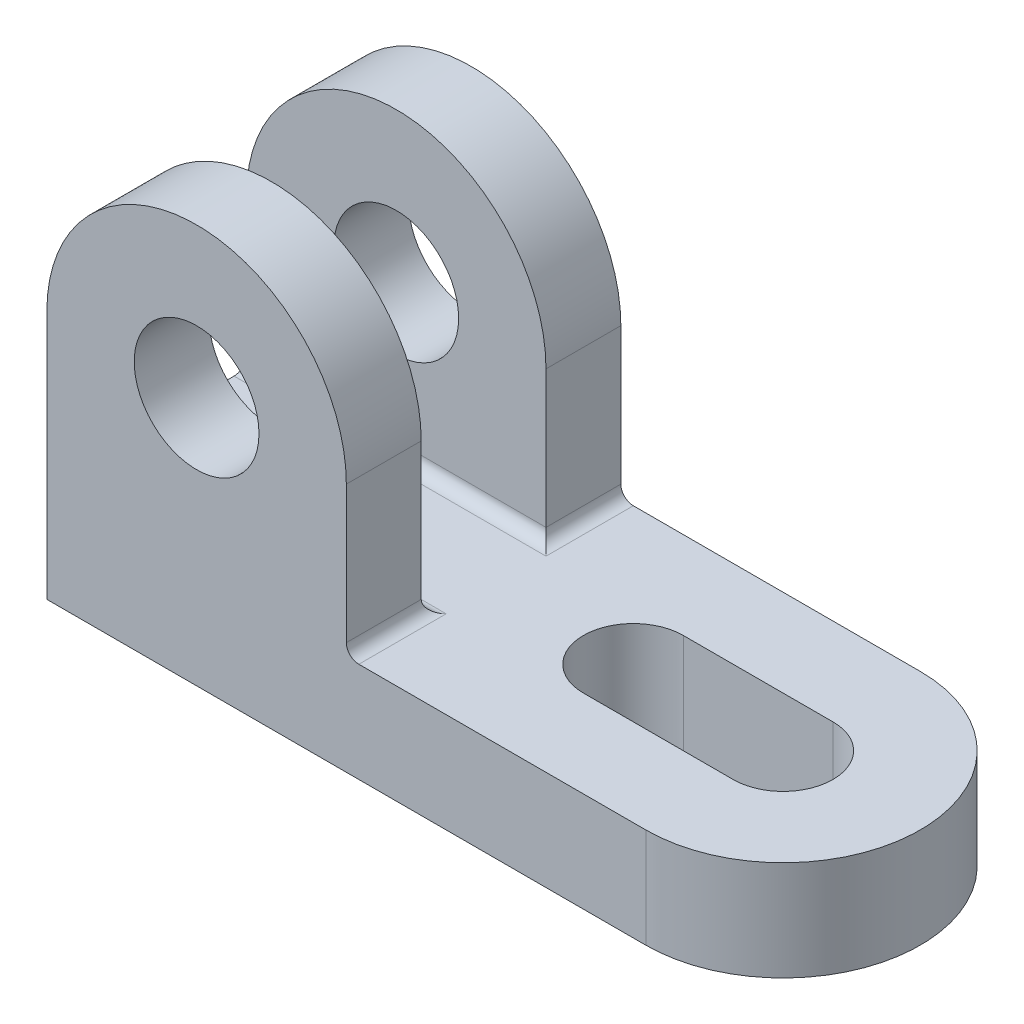
ISO-10303-21;
HEADER;
FILE_DESCRIPTION(('STEP AP214'),'2;1');
FILE_NAME('part.step','',(''),(''),'','','');
FILE_SCHEMA(('AUTOMOTIVE_DESIGN { 1 0 10303 214 1 1 1 1 }'));
ENDSEC;
DATA;
#1=APPLICATION_CONTEXT('core data for automotive mechanical design processes');
#2=APPLICATION_PROTOCOL_DEFINITION('international standard','automotive_design',2000,#1);
#3=PRODUCT_CONTEXT('',#1,'mechanical');
#4=PRODUCT('Part','Part','',(#3));
#5=PRODUCT_RELATED_PRODUCT_CATEGORY('part','',(#4));
#6=PRODUCT_DEFINITION_FORMATION('','',#4);
#7=PRODUCT_DEFINITION_CONTEXT('part definition',#1,'design');
#8=PRODUCT_DEFINITION('design','',#6,#7);
#9=PRODUCT_DEFINITION_SHAPE('','',#8);
#10=(LENGTH_UNIT() NAMED_UNIT(*) SI_UNIT(.MILLI.,.METRE.));
#11=(NAMED_UNIT(*) PLANE_ANGLE_UNIT() SI_UNIT($,.RADIAN.));
#12=(NAMED_UNIT(*) SI_UNIT($,.STERADIAN.) SOLID_ANGLE_UNIT());
#13=UNCERTAINTY_MEASURE_WITH_UNIT(LENGTH_MEASURE(1.E-05),#10,'distance_accuracy_value','');
#14=(GEOMETRIC_REPRESENTATION_CONTEXT(3) GLOBAL_UNCERTAINTY_ASSIGNED_CONTEXT((#13)) GLOBAL_UNIT_ASSIGNED_CONTEXT((#10,
#11,#12)) REPRESENTATION_CONTEXT('',''));
#15=CARTESIAN_POINT('',(0.,0.,0.));
#16=DIRECTION('',(0.,0.,1.));
#17=DIRECTION('',(1.,0.,0.));
#18=AXIS2_PLACEMENT_3D('',#15,#16,#17);
#19=CARTESIAN_POINT('',(0.,16.,0.));
#20=DIRECTION('',(0.,1.,0.));
#21=DIRECTION('',(0.,0.,1.));
#22=AXIS2_PLACEMENT_3D('',#19,#20,#21);
#23=PLANE('',#22);
#24=CARTESIAN_POINT('',(37.,16.,0.));
#25=DIRECTION('',(0.,1.,0.));
#26=DIRECTION('',(0.,0.,1.));
#27=AXIS2_PLACEMENT_3D('',#24,#25,#26);
#28=CIRCLE('',#27,8.);
#29=CARTESIAN_POINT('',(37.,16.,8.));
#30=VERTEX_POINT('',#29);
#31=CARTESIAN_POINT('',(37.,16.,-8.));
#32=VERTEX_POINT('',#31);
#33=EDGE_CURVE('E229',#30,#32,#28,.T.);
#34=ORIENTED_EDGE('',*,*,#33,.F.);
#35=DIRECTION('',(1.,0.,0.));
#36=VECTOR('',#35,1.);
#37=CARTESIAN_POINT('',(37.,16.,8.));
#38=LINE('',#37,#36);
#39=CARTESIAN_POINT('',(13.,16.,8.));
#40=VERTEX_POINT('',#39);
#41=EDGE_CURVE('E238',#40,#30,#38,.T.);
#42=ORIENTED_EDGE('',*,*,#41,.F.);
#43=CARTESIAN_POINT('',(13.,16.,0.));
#44=DIRECTION('',(0.,1.,0.));
#45=DIRECTION('',(0.,0.,1.));
#46=AXIS2_PLACEMENT_3D('',#43,#44,#45);
#47=CIRCLE('',#46,8.);
#48=CARTESIAN_POINT('',(13.,16.,-7.99999999999999));
#49=VERTEX_POINT('',#48);
#50=EDGE_CURVE('E257',#49,#40,#47,.T.);
#51=ORIENTED_EDGE('',*,*,#50,.F.);
#52=DIRECTION('',(-1.,0.,0.));
#53=VECTOR('',#52,1.);
#54=CARTESIAN_POINT('',(37.,16.,-8.));
#55=LINE('',#54,#53);
#56=EDGE_CURVE('E253',#32,#49,#55,.T.);
#57=ORIENTED_EDGE('',*,*,#56,.F.);
#58=EDGE_LOOP('',(#34,#42,#51,#57));
#59=FACE_BOUND('',#58,.T.);
#60=DIRECTION('',(-1.,0.,0.));
#61=VECTOR('',#60,1.);
#62=CARTESIAN_POINT('',(0.,16.,8.));
#63=LINE('',#62,#61);
#64=CARTESIAN_POINT('',(-59.,16.,8.));
#65=VERTEX_POINT('',#64);
#66=CARTESIAN_POINT('',(-9.,16.,8.));
#67=VERTEX_POINT('',#66);
#68=EDGE_CURVE('E324',#65,#67,#63,.F.);
#69=ORIENTED_EDGE('',*,*,#68,.T.);
#70=DIRECTION('',(0.,0.,1.));
#71=VECTOR('',#70,1.);
#72=CARTESIAN_POINT('',(-9.,16.,22.));
#73=LINE('',#72,#71);
#74=CARTESIAN_POINT('',(-9.,16.,22.));
#75=VERTEX_POINT('',#74);
#76=EDGE_CURVE('E327',#67,#75,#73,.T.);
#77=ORIENTED_EDGE('',*,*,#76,.T.);
#78=DIRECTION('',(1.,0.,0.));
#79=VECTOR('',#78,1.);
#80=CARTESIAN_POINT('',(0.,16.,22.));
#81=LINE('',#80,#79);
#82=CARTESIAN_POINT('',(37.,16.,22.));
#83=VERTEX_POINT('',#82);
#84=EDGE_CURVE('E277',#75,#83,#81,.T.);
#85=ORIENTED_EDGE('',*,*,#84,.T.);
#86=CARTESIAN_POINT('',(37.,16.,0.));
#87=DIRECTION('',(0.,1.,0.));
#88=DIRECTION('',(0.,0.,1.));
#89=AXIS2_PLACEMENT_3D('',#86,#87,#88);
#90=CIRCLE('',#89,22.);
#91=CARTESIAN_POINT('',(37.,16.,-22.));
#92=VERTEX_POINT('',#91);
#93=EDGE_CURVE('E280',#83,#92,#90,.T.);
#94=ORIENTED_EDGE('',*,*,#93,.T.);
#95=DIRECTION('',(1.,0.,0.));
#96=VECTOR('',#95,1.);
#97=CARTESIAN_POINT('',(0.,16.,-22.));
#98=LINE('',#97,#96);
#99=CARTESIAN_POINT('',(-9.,16.,-22.));
#100=VERTEX_POINT('',#99);
#101=EDGE_CURVE('E285',#100,#92,#98,.T.);
#102=ORIENTED_EDGE('',*,*,#101,.F.);
#103=DIRECTION('',(0.,0.,-1.));
#104=VECTOR('',#103,1.);
#105=CARTESIAN_POINT('',(-9.,16.,0.));
#106=LINE('',#105,#104);
#107=CARTESIAN_POINT('',(-9.,16.,-8.));
#108=VERTEX_POINT('',#107);
#109=EDGE_CURVE('E321',#100,#108,#106,.F.);
#110=ORIENTED_EDGE('',*,*,#109,.T.);
#111=DIRECTION('',(-1.,0.,0.));
#112=VECTOR('',#111,1.);
#113=CARTESIAN_POINT('',(0.,16.,-8.));
#114=LINE('',#113,#112);
#115=CARTESIAN_POINT('',(-59.,16.,-8.));
#116=VERTEX_POINT('',#115);
#117=EDGE_CURVE('E318',#108,#116,#114,.T.);
#118=ORIENTED_EDGE('',*,*,#117,.T.);
#119=DIRECTION('',(0.,0.,-1.));
#120=VECTOR('',#119,1.);
#121=CARTESIAN_POINT('',(-59.,16.,0.));
#122=LINE('',#121,#120);
#123=EDGE_CURVE('E288',#65,#116,#122,.T.);
#124=ORIENTED_EDGE('',*,*,#123,.F.);
#125=EDGE_LOOP('',(#69,#77,#85,#94,#102,#110,#118,#124));
#126=FACE_BOUND('',#125,.T.);
#127=ADVANCED_FACE('F49',(#59,#126),#23,.T.);
#128=CARTESIAN_POINT('',(0.,16.,22.));
#129=DIRECTION('',(0.,0.,-1.));
#130=DIRECTION('',(-1.,0.,0.));
#131=AXIS2_PLACEMENT_3D('',#128,#129,#130);
#132=PLANE('',#131);
#133=DIRECTION('',(1.,0.,0.));
#134=VECTOR('',#133,1.);
#135=CARTESIAN_POINT('',(0.,0.,22.));
#136=LINE('',#135,#134);
#137=CARTESIAN_POINT('',(-59.,0.,22.));
#138=VERTEX_POINT('',#137);
#139=CARTESIAN_POINT('',(37.,0.,22.));
#140=VERTEX_POINT('',#139);
#141=EDGE_CURVE('E267',#138,#140,#136,.T.);
#142=ORIENTED_EDGE('',*,*,#141,.T.);
#143=DIRECTION('',(0.,-1.,0.));
#144=VECTOR('',#143,1.);
#145=CARTESIAN_POINT('',(37.,16.,22.));
#146=LINE('',#145,#144);
#147=EDGE_CURVE('E314',#83,#140,#146,.T.);
#148=ORIENTED_EDGE('',*,*,#147,.F.);
#149=ORIENTED_EDGE('',*,*,#84,.F.);
#150=CARTESIAN_POINT('',(-9.,18.,22.));
#151=DIRECTION('',(0.,0.,-1.));
#152=DIRECTION('',(-1.,0.,0.));
#153=AXIS2_PLACEMENT_3D('',#150,#151,#152);
#154=CIRCLE('',#153,2.);
#155=CARTESIAN_POINT('',(-11.,18.,22.));
#156=VERTEX_POINT('',#155);
#157=EDGE_CURVE('E343',#75,#156,#154,.T.);
#158=ORIENTED_EDGE('',*,*,#157,.T.);
#159=DIRECTION('',(0.,1.,0.));
#160=VECTOR('',#159,1.);
#161=CARTESIAN_POINT('',(-11.,0.,22.));
#162=LINE('',#161,#160);
#163=CARTESIAN_POINT('',(-11.,40.,22.));
#164=VERTEX_POINT('',#163);
#165=EDGE_CURVE('E219',#156,#164,#162,.T.);
#166=ORIENTED_EDGE('',*,*,#165,.T.);
#167=CARTESIAN_POINT('',(-35.,40.,22.));
#168=DIRECTION('',(0.,0.,1.));
#169=DIRECTION('',(1.,0.,0.));
#170=AXIS2_PLACEMENT_3D('',#167,#168,#169);
#171=CIRCLE('',#170,24.);
#172=CARTESIAN_POINT('',(-59.,40.,22.));
#173=VERTEX_POINT('',#172);
#174=EDGE_CURVE('E205',#164,#173,#171,.T.);
#175=ORIENTED_EDGE('',*,*,#174,.T.);
#176=DIRECTION('',(0.,-1.,0.));
#177=VECTOR('',#176,1.);
#178=CARTESIAN_POINT('',(-59.,16.,22.));
#179=LINE('',#178,#177);
#180=EDGE_CURVE('E291',#173,#138,#179,.T.);
#181=ORIENTED_EDGE('',*,*,#180,.T.);
#182=EDGE_LOOP('',(#142,#148,#149,#158,#166,#175,#181));
#183=FACE_BOUND('',#182,.T.);
#184=CARTESIAN_POINT('',(-35.,40.,22.));
#185=DIRECTION('',(0.,0.,1.));
#186=DIRECTION('',(1.,0.,0.));
#187=AXIS2_PLACEMENT_3D('',#184,#185,#186);
#188=CIRCLE('',#187,10.);
#189=CARTESIAN_POINT('',(-25.,40.,22.));
#190=VERTEX_POINT('',#189);
#191=EDGE_CURVE('E195',#190,#190,#188,.T.);
#192=ORIENTED_EDGE('',*,*,#191,.F.);
#193=EDGE_LOOP('',(#192));
#194=FACE_BOUND('',#193,.T.);
#195=ADVANCED_FACE('F384',(#183,#194),#132,.F.);
#196=CARTESIAN_POINT('',(37.,16.,0.));
#197=DIRECTION('',(0.,-1.,0.));
#198=DIRECTION('',(0.,0.,-1.));
#199=AXIS2_PLACEMENT_3D('',#196,#197,#198);
#200=CYLINDRICAL_SURFACE('',#199,22.);
#201=CARTESIAN_POINT('',(37.,0.,0.));
#202=DIRECTION('',(0.,1.,0.));
#203=DIRECTION('',(0.,0.,1.));
#204=AXIS2_PLACEMENT_3D('',#201,#202,#203);
#205=CIRCLE('',#204,22.);
#206=CARTESIAN_POINT('',(37.,0.,-22.));
#207=VERTEX_POINT('',#206);
#208=EDGE_CURVE('E295',#140,#207,#205,.T.);
#209=ORIENTED_EDGE('',*,*,#208,.T.);
#210=DIRECTION('',(0.,-1.,0.));
#211=VECTOR('',#210,1.);
#212=CARTESIAN_POINT('',(37.,16.,-22.));
#213=LINE('',#212,#211);
#214=EDGE_CURVE('E311',#92,#207,#213,.T.);
#215=ORIENTED_EDGE('',*,*,#214,.F.);
#216=ORIENTED_EDGE('',*,*,#93,.F.);
#217=ORIENTED_EDGE('',*,*,#147,.T.);
#218=EDGE_LOOP('',(#209,#215,#216,#217));
#219=FACE_BOUND('',#218,.T.);
#220=ADVANCED_FACE('F389',(#219),#200,.T.);
#221=CARTESIAN_POINT('',(0.,16.,-22.));
#222=DIRECTION('',(0.,0.,-1.));
#223=DIRECTION('',(-1.,0.,0.));
#224=AXIS2_PLACEMENT_3D('',#221,#222,#223);
#225=PLANE('',#224);
#226=DIRECTION('',(1.,0.,0.));
#227=VECTOR('',#226,1.);
#228=CARTESIAN_POINT('',(0.,0.,-22.));
#229=LINE('',#228,#227);
#230=CARTESIAN_POINT('',(-59.,0.,-22.));
#231=VERTEX_POINT('',#230);
#232=EDGE_CURVE('E299',#231,#207,#229,.T.);
#233=ORIENTED_EDGE('',*,*,#232,.F.);
#234=DIRECTION('',(0.,-1.,0.));
#235=VECTOR('',#234,1.);
#236=CARTESIAN_POINT('',(-59.,16.,-22.));
#237=LINE('',#236,#235);
#238=CARTESIAN_POINT('',(-59.,40.,-22.));
#239=VERTEX_POINT('',#238);
#240=EDGE_CURVE('E308',#239,#231,#237,.T.);
#241=ORIENTED_EDGE('',*,*,#240,.F.);
#242=CARTESIAN_POINT('',(-35.,40.,-22.));
#243=DIRECTION('',(0.,0.,1.));
#244=DIRECTION('',(1.,0.,0.));
#245=AXIS2_PLACEMENT_3D('',#242,#243,#244);
#246=CIRCLE('',#245,24.);
#247=CARTESIAN_POINT('',(-11.,40.,-22.));
#248=VERTEX_POINT('',#247);
#249=EDGE_CURVE('E189',#248,#239,#246,.T.);
#250=ORIENTED_EDGE('',*,*,#249,.F.);
#251=DIRECTION('',(0.,1.,0.));
#252=VECTOR('',#251,1.);
#253=CARTESIAN_POINT('',(-11.,0.,-22.));
#254=LINE('',#253,#252);
#255=CARTESIAN_POINT('',(-11.,18.,-22.));
#256=VERTEX_POINT('',#255);
#257=EDGE_CURVE('E396',#256,#248,#254,.T.);
#258=ORIENTED_EDGE('',*,*,#257,.F.);
#259=CARTESIAN_POINT('',(-9.,18.,-22.));
#260=DIRECTION('',(0.,0.,-1.));
#261=DIRECTION('',(-1.,0.,0.));
#262=AXIS2_PLACEMENT_3D('',#259,#260,#261);
#263=CIRCLE('',#262,2.);
#264=EDGE_CURVE('E59',#256,#100,#263,.F.);
#265=ORIENTED_EDGE('',*,*,#264,.T.);
#266=ORIENTED_EDGE('',*,*,#101,.T.);
#267=ORIENTED_EDGE('',*,*,#214,.T.);
#268=EDGE_LOOP('',(#233,#241,#250,#258,#265,#266,#267));
#269=FACE_BOUND('',#268,.T.);
#270=CARTESIAN_POINT('',(-35.,40.,-22.));
#271=DIRECTION('',(0.,0.,1.));
#272=DIRECTION('',(1.,0.,0.));
#273=AXIS2_PLACEMENT_3D('',#270,#271,#272);
#274=CIRCLE('',#273,10.);
#275=CARTESIAN_POINT('',(-25.,40.,-22.));
#276=VERTEX_POINT('',#275);
#277=EDGE_CURVE('E353',#276,#276,#274,.T.);
#278=ORIENTED_EDGE('',*,*,#277,.T.);
#279=EDGE_LOOP('',(#278));
#280=FACE_BOUND('',#279,.T.);
#281=ADVANCED_FACE('F393',(#269,#280),#225,.T.);
#282=CARTESIAN_POINT('',(-59.,16.,0.));
#283=DIRECTION('',(-1.,0.,0.));
#284=DIRECTION('',(0.,0.,1.));
#285=AXIS2_PLACEMENT_3D('',#282,#283,#284);
#286=PLANE('',#285);
#287=DIRECTION('',(0.,0.,-1.));
#288=VECTOR('',#287,1.);
#289=CARTESIAN_POINT('',(-59.,0.,0.));
#290=LINE('',#289,#288);
#291=EDGE_CURVE('E281',#138,#231,#290,.T.);
#292=ORIENTED_EDGE('',*,*,#291,.F.);
#293=ORIENTED_EDGE('',*,*,#180,.F.);
#294=DIRECTION('',(0.,0.,1.));
#295=VECTOR('',#294,1.);
#296=CARTESIAN_POINT('',(-59.,40.,10.));
#297=LINE('',#296,#295);
#298=CARTESIAN_POINT('',(-59.,40.,10.));
#299=VERTEX_POINT('',#298);
#300=EDGE_CURVE('E225',#299,#173,#297,.T.);
#301=ORIENTED_EDGE('',*,*,#300,.F.);
#302=DIRECTION('',(0.,1.,0.));
#303=VECTOR('',#302,1.);
#304=CARTESIAN_POINT('',(-59.,0.,10.));
#305=LINE('',#304,#303);
#306=CARTESIAN_POINT('',(-59.,18.,10.));
#307=VERTEX_POINT('',#306);
#308=EDGE_CURVE('E212',#307,#299,#305,.T.);
#309=ORIENTED_EDGE('',*,*,#308,.F.);
#310=CARTESIAN_POINT('',(-59.,18.,8.));
#311=DIRECTION('',(-1.,0.,0.));
#312=DIRECTION('',(0.,0.,1.));
#313=AXIS2_PLACEMENT_3D('',#310,#311,#312);
#314=CIRCLE('',#313,2.);
#315=EDGE_CURVE('E346',#307,#65,#314,.F.);
#316=ORIENTED_EDGE('',*,*,#315,.T.);
#317=ORIENTED_EDGE('',*,*,#123,.T.);
#318=CARTESIAN_POINT('',(-59.,18.,-8.));
#319=DIRECTION('',(-1.,0.,0.));
#320=DIRECTION('',(0.,0.,1.));
#321=AXIS2_PLACEMENT_3D('',#318,#319,#320);
#322=CIRCLE('',#321,2.);
#323=CARTESIAN_POINT('',(-59.,18.,-10.));
#324=VERTEX_POINT('',#323);
#325=EDGE_CURVE('E11',#116,#324,#322,.F.);
#326=ORIENTED_EDGE('',*,*,#325,.T.);
#327=DIRECTION('',(0.,1.,0.));
#328=VECTOR('',#327,1.);
#329=CARTESIAN_POINT('',(-59.,0.,-10.));
#330=LINE('',#329,#328);
#331=CARTESIAN_POINT('',(-59.,40.,-10.));
#332=VERTEX_POINT('',#331);
#333=EDGE_CURVE('E168',#324,#332,#330,.T.);
#334=ORIENTED_EDGE('',*,*,#333,.T.);
#335=DIRECTION('',(0.,0.,-1.));
#336=VECTOR('',#335,1.);
#337=CARTESIAN_POINT('',(-59.,40.,-10.));
#338=LINE('',#337,#336);
#339=EDGE_CURVE('E173',#332,#239,#338,.T.);
#340=ORIENTED_EDGE('',*,*,#339,.T.);
#341=ORIENTED_EDGE('',*,*,#240,.T.);
#342=EDGE_LOOP('',(#292,#293,#301,#309,#316,#317,#326,#334,#340,#341));
#343=FACE_BOUND('',#342,.T.);
#344=ADVANCED_FACE('F171',(#343),#286,.T.);
#345=CARTESIAN_POINT('',(0.,0.,0.));
#346=DIRECTION('',(0.,1.,0.));
#347=DIRECTION('',(0.,0.,1.));
#348=AXIS2_PLACEMENT_3D('',#345,#346,#347);
#349=PLANE('',#348);
#350=DIRECTION('',(1.,0.,0.));
#351=VECTOR('',#350,1.);
#352=CARTESIAN_POINT('',(37.,0.,8.));
#353=LINE('',#352,#351);
#354=CARTESIAN_POINT('',(13.,0.,8.));
#355=VERTEX_POINT('',#354);
#356=CARTESIAN_POINT('',(37.,0.,8.));
#357=VERTEX_POINT('',#356);
#358=EDGE_CURVE('E246',#355,#357,#353,.T.);
#359=ORIENTED_EDGE('',*,*,#358,.T.);
#360=CARTESIAN_POINT('',(37.,0.,0.));
#361=DIRECTION('',(0.,1.,0.));
#362=DIRECTION('',(0.,0.,1.));
#363=AXIS2_PLACEMENT_3D('',#360,#361,#362);
#364=CIRCLE('',#363,8.);
#365=CARTESIAN_POINT('',(37.,0.,-8.));
#366=VERTEX_POINT('',#365);
#367=EDGE_CURVE('E233',#357,#366,#364,.T.);
#368=ORIENTED_EDGE('',*,*,#367,.T.);
#369=DIRECTION('',(-1.,0.,0.));
#370=VECTOR('',#369,1.);
#371=CARTESIAN_POINT('',(37.,0.,-8.));
#372=LINE('',#371,#370);
#373=CARTESIAN_POINT('',(13.,0.,-7.99999999999999));
#374=VERTEX_POINT('',#373);
#375=EDGE_CURVE('E237',#366,#374,#372,.T.);
#376=ORIENTED_EDGE('',*,*,#375,.T.);
#377=CARTESIAN_POINT('',(13.,0.,0.));
#378=DIRECTION('',(0.,1.,0.));
#379=DIRECTION('',(0.,0.,1.));
#380=AXIS2_PLACEMENT_3D('',#377,#378,#379);
#381=CIRCLE('',#380,8.);
#382=EDGE_CURVE('E242',#374,#355,#381,.T.);
#383=ORIENTED_EDGE('',*,*,#382,.T.);
#384=EDGE_LOOP('',(#359,#368,#376,#383));
#385=FACE_BOUND('',#384,.T.);
#386=ORIENTED_EDGE('',*,*,#141,.F.);
#387=ORIENTED_EDGE('',*,*,#291,.T.);
#388=ORIENTED_EDGE('',*,*,#232,.T.);
#389=ORIENTED_EDGE('',*,*,#208,.F.);
#390=EDGE_LOOP('',(#386,#387,#388,#389));
#391=FACE_BOUND('',#390,.T.);
#392=ADVANCED_FACE('F434',(#385,#391),#349,.F.);
#393=CARTESIAN_POINT('',(37.,0.,0.));
#394=DIRECTION('',(0.,1.,0.));
#395=DIRECTION('',(0.,0.,1.));
#396=AXIS2_PLACEMENT_3D('',#393,#394,#395);
#397=CYLINDRICAL_SURFACE('',#396,8.);
#398=ORIENTED_EDGE('',*,*,#33,.T.);
#399=DIRECTION('',(0.,1.,0.));
#400=VECTOR('',#399,1.);
#401=CARTESIAN_POINT('',(37.,0.,-8.));
#402=LINE('',#401,#400);
#403=EDGE_CURVE('E250',#366,#32,#402,.T.);
#404=ORIENTED_EDGE('',*,*,#403,.F.);
#405=ORIENTED_EDGE('',*,*,#367,.F.);
#406=DIRECTION('',(0.,1.,0.));
#407=VECTOR('',#406,1.);
#408=CARTESIAN_POINT('',(37.,0.,8.));
#409=LINE('',#408,#407);
#410=EDGE_CURVE('E264',#357,#30,#409,.T.);
#411=ORIENTED_EDGE('',*,*,#410,.T.);
#412=EDGE_LOOP('',(#398,#404,#405,#411));
#413=FACE_BOUND('',#412,.T.);
#414=ADVANCED_FACE('F432',(#413),#397,.F.);
#415=CARTESIAN_POINT('',(37.,0.,8.));
#416=DIRECTION('',(0.,0.,1.));
#417=DIRECTION('',(1.,0.,0.));
#418=AXIS2_PLACEMENT_3D('',#415,#416,#417);
#419=PLANE('',#418);
#420=ORIENTED_EDGE('',*,*,#41,.T.);
#421=ORIENTED_EDGE('',*,*,#410,.F.);
#422=ORIENTED_EDGE('',*,*,#358,.F.);
#423=DIRECTION('',(0.,1.,0.));
#424=VECTOR('',#423,1.);
#425=CARTESIAN_POINT('',(13.,0.,8.));
#426=LINE('',#425,#424);
#427=EDGE_CURVE('E268',#355,#40,#426,.T.);
#428=ORIENTED_EDGE('',*,*,#427,.T.);
#429=EDGE_LOOP('',(#420,#421,#422,#428));
#430=FACE_BOUND('',#429,.T.);
#431=ADVANCED_FACE('F569',(#430),#419,.F.);
#432=CARTESIAN_POINT('',(13.,0.,0.));
#433=DIRECTION('',(0.,1.,0.));
#434=DIRECTION('',(0.,0.,1.));
#435=AXIS2_PLACEMENT_3D('',#432,#433,#434);
#436=CYLINDRICAL_SURFACE('',#435,8.);
#437=ORIENTED_EDGE('',*,*,#50,.T.);
#438=ORIENTED_EDGE('',*,*,#427,.F.);
#439=ORIENTED_EDGE('',*,*,#382,.F.);
#440=DIRECTION('',(0.,1.,0.));
#441=VECTOR('',#440,1.);
#442=CARTESIAN_POINT('',(13.,0.,-7.99999999999999));
#443=LINE('',#442,#441);
#444=EDGE_CURVE('E271',#374,#49,#443,.T.);
#445=ORIENTED_EDGE('',*,*,#444,.T.);
#446=EDGE_LOOP('',(#437,#438,#439,#445));
#447=FACE_BOUND('',#446,.T.);
#448=ADVANCED_FACE('F560',(#447),#436,.F.);
#449=CARTESIAN_POINT('',(37.,0.,-8.));
#450=DIRECTION('',(0.,0.,-1.));
#451=DIRECTION('',(-1.,0.,0.));
#452=AXIS2_PLACEMENT_3D('',#449,#450,#451);
#453=PLANE('',#452);
#454=ORIENTED_EDGE('',*,*,#56,.T.);
#455=ORIENTED_EDGE('',*,*,#444,.F.);
#456=ORIENTED_EDGE('',*,*,#375,.F.);
#457=ORIENTED_EDGE('',*,*,#403,.T.);
#458=EDGE_LOOP('',(#454,#455,#456,#457));
#459=FACE_BOUND('',#458,.T.);
#460=ADVANCED_FACE('F550',(#459),#453,.F.);
#461=CARTESIAN_POINT('',(-35.,40.,10.));
#462=DIRECTION('',(0.,0.,1.));
#463=DIRECTION('',(1.,0.,0.));
#464=AXIS2_PLACEMENT_3D('',#461,#462,#463);
#465=CYLINDRICAL_SURFACE('',#464,24.);
#466=ORIENTED_EDGE('',*,*,#174,.F.);
#467=DIRECTION('',(0.,0.,1.));
#468=VECTOR('',#467,1.);
#469=CARTESIAN_POINT('',(-11.,40.,10.));
#470=LINE('',#469,#468);
#471=CARTESIAN_POINT('',(-11.,40.,10.));
#472=VERTEX_POINT('',#471);
#473=EDGE_CURVE('E215',#472,#164,#470,.T.);
#474=ORIENTED_EDGE('',*,*,#473,.F.);
#475=CARTESIAN_POINT('',(-35.,40.,10.));
#476=DIRECTION('',(0.,0.,1.));
#477=DIRECTION('',(1.,0.,0.));
#478=AXIS2_PLACEMENT_3D('',#475,#476,#477);
#479=CIRCLE('',#478,24.);
#480=EDGE_CURVE('E208',#472,#299,#479,.T.);
#481=ORIENTED_EDGE('',*,*,#480,.T.);
#482=ORIENTED_EDGE('',*,*,#300,.T.);
#483=EDGE_LOOP('',(#466,#474,#481,#482));
#484=FACE_BOUND('',#483,.T.);
#485=ADVANCED_FACE('F541',(#484),#465,.T.);
#486=CARTESIAN_POINT('',(-35.,40.,10.));
#487=DIRECTION('',(0.,0.,1.));
#488=DIRECTION('',(1.,0.,0.));
#489=AXIS2_PLACEMENT_3D('',#486,#487,#488);
#490=CYLINDRICAL_SURFACE('',#489,10.);
#491=CARTESIAN_POINT('',(-35.,40.,10.));
#492=DIRECTION('',(0.,0.,1.));
#493=DIRECTION('',(1.,0.,0.));
#494=AXIS2_PLACEMENT_3D('',#491,#492,#493);
#495=CIRCLE('',#494,10.);
#496=CARTESIAN_POINT('',(-25.,40.,10.));
#497=VERTEX_POINT('',#496);
#498=EDGE_CURVE('E200',#497,#497,#495,.T.);
#499=ORIENTED_EDGE('',*,*,#498,.F.);
#500=EDGE_LOOP('',(#499));
#501=FACE_BOUND('',#500,.T.);
#502=ORIENTED_EDGE('',*,*,#191,.T.);
#503=EDGE_LOOP('',(#502));
#504=FACE_BOUND('',#503,.T.);
#505=ADVANCED_FACE('F532',(#501,#504),#490,.F.);
#506=CARTESIAN_POINT('',(-11.,0.,10.));
#507=DIRECTION('',(1.,0.,0.));
#508=DIRECTION('',(0.,1.,0.));
#509=AXIS2_PLACEMENT_3D('',#506,#507,#508);
#510=PLANE('',#509);
#511=ORIENTED_EDGE('',*,*,#165,.F.);
#512=DIRECTION('',(0.,0.,1.));
#513=VECTOR('',#512,1.);
#514=CARTESIAN_POINT('',(-11.,18.,10.));
#515=LINE('',#514,#513);
#516=CARTESIAN_POINT('',(-11.,18.,10.));
#517=VERTEX_POINT('',#516);
#518=EDGE_CURVE('E331',#156,#517,#515,.F.);
#519=ORIENTED_EDGE('',*,*,#518,.T.);
#520=DIRECTION('',(0.,1.,0.));
#521=VECTOR('',#520,1.);
#522=CARTESIAN_POINT('',(-11.,0.,10.));
#523=LINE('',#522,#521);
#524=EDGE_CURVE('E204',#517,#472,#523,.T.);
#525=ORIENTED_EDGE('',*,*,#524,.T.);
#526=ORIENTED_EDGE('',*,*,#473,.T.);
#527=EDGE_LOOP('',(#511,#519,#525,#526));
#528=FACE_BOUND('',#527,.T.);
#529=ADVANCED_FACE('F522',(#528),#510,.T.);
#530=CARTESIAN_POINT('',(0.,0.,10.));
#531=DIRECTION('',(0.,0.,1.));
#532=DIRECTION('',(1.,0.,0.));
#533=AXIS2_PLACEMENT_3D('',#530,#531,#532);
#534=PLANE('',#533);
#535=ORIENTED_EDGE('',*,*,#498,.T.);
#536=EDGE_LOOP('',(#535));
#537=FACE_BOUND('',#536,.T.);
#538=ORIENTED_EDGE('',*,*,#524,.F.);
#539=DIRECTION('',(-1.,0.,0.));
#540=VECTOR('',#539,1.);
#541=CARTESIAN_POINT('',(0.,18.,10.));
#542=LINE('',#541,#540);
#543=EDGE_CURVE('E334',#517,#307,#542,.T.);
#544=ORIENTED_EDGE('',*,*,#543,.T.);
#545=ORIENTED_EDGE('',*,*,#308,.T.);
#546=ORIENTED_EDGE('',*,*,#480,.F.);
#547=EDGE_LOOP('',(#538,#544,#545,#546));
#548=FACE_BOUND('',#547,.T.);
#549=ADVANCED_FACE('F507',(#537,#548),#534,.F.);
#550=CARTESIAN_POINT('',(-11.,0.,-10.));
#551=DIRECTION('',(-1.,0.,0.));
#552=DIRECTION('',(0.,-1.,0.));
#553=AXIS2_PLACEMENT_3D('',#550,#551,#552);
#554=PLANE('',#553);
#555=DIRECTION('',(0.,1.,0.));
#556=VECTOR('',#555,1.);
#557=CARTESIAN_POINT('',(-11.,0.,-10.));
#558=LINE('',#557,#556);
#559=CARTESIAN_POINT('',(-11.,18.,-10.));
#560=VERTEX_POINT('',#559);
#561=CARTESIAN_POINT('',(-11.,40.,-10.));
#562=VERTEX_POINT('',#561);
#563=EDGE_CURVE('E181',#560,#562,#558,.T.);
#564=ORIENTED_EDGE('',*,*,#563,.F.);
#565=DIRECTION('',(0.,0.,-1.));
#566=VECTOR('',#565,1.);
#567=CARTESIAN_POINT('',(-11.,18.,-10.));
#568=LINE('',#567,#566);
#569=EDGE_CURVE('E337',#560,#256,#568,.T.);
#570=ORIENTED_EDGE('',*,*,#569,.T.);
#571=ORIENTED_EDGE('',*,*,#257,.T.);
#572=DIRECTION('',(0.,0.,-1.));
#573=VECTOR('',#572,1.);
#574=CARTESIAN_POINT('',(-11.,40.,-10.));
#575=LINE('',#574,#573);
#576=EDGE_CURVE('E191',#562,#248,#575,.T.);
#577=ORIENTED_EDGE('',*,*,#576,.F.);
#578=EDGE_LOOP('',(#564,#570,#571,#577));
#579=FACE_BOUND('',#578,.T.);
#580=ADVANCED_FACE('F398',(#579),#554,.F.);
#581=CARTESIAN_POINT('',(-35.,40.,-10.));
#582=DIRECTION('',(0.,0.,-1.));
#583=DIRECTION('',(-1.,0.,0.));
#584=AXIS2_PLACEMENT_3D('',#581,#582,#583);
#585=CYLINDRICAL_SURFACE('',#584,24.);
#586=ORIENTED_EDGE('',*,*,#249,.T.);
#587=ORIENTED_EDGE('',*,*,#339,.F.);
#588=CARTESIAN_POINT('',(-35.,40.,-10.));
#589=DIRECTION('',(0.,0.,1.));
#590=DIRECTION('',(1.,0.,0.));
#591=AXIS2_PLACEMENT_3D('',#588,#589,#590);
#592=CIRCLE('',#591,24.);
#593=EDGE_CURVE('E176',#562,#332,#592,.T.);
#594=ORIENTED_EDGE('',*,*,#593,.F.);
#595=ORIENTED_EDGE('',*,*,#576,.T.);
#596=EDGE_LOOP('',(#586,#587,#594,#595));
#597=FACE_BOUND('',#596,.T.);
#598=ADVANCED_FACE('F187',(#597),#585,.T.);
#599=CARTESIAN_POINT('',(-35.,40.,-10.));
#600=DIRECTION('',(0.,0.,-1.));
#601=DIRECTION('',(-1.,0.,0.));
#602=AXIS2_PLACEMENT_3D('',#599,#600,#601);
#603=CYLINDRICAL_SURFACE('',#602,10.);
#604=CARTESIAN_POINT('',(-35.,40.,-10.));
#605=DIRECTION('',(0.,0.,1.));
#606=DIRECTION('',(1.,0.,0.));
#607=AXIS2_PLACEMENT_3D('',#604,#605,#606);
#608=CIRCLE('',#607,10.);
#609=CARTESIAN_POINT('',(-25.,40.,-10.));
#610=VERTEX_POINT('',#609);
#611=EDGE_CURVE('E177',#610,#610,#608,.T.);
#612=ORIENTED_EDGE('',*,*,#611,.T.);
#613=EDGE_LOOP('',(#612));
#614=FACE_BOUND('',#613,.T.);
#615=ORIENTED_EDGE('',*,*,#277,.F.);
#616=EDGE_LOOP('',(#615));
#617=FACE_BOUND('',#616,.T.);
#618=ADVANCED_FACE('F407',(#614,#617),#603,.F.);
#619=CARTESIAN_POINT('',(0.,0.,-10.));
#620=DIRECTION('',(0.,0.,-1.));
#621=DIRECTION('',(1.,0.,0.));
#622=AXIS2_PLACEMENT_3D('',#619,#620,#621);
#623=PLANE('',#622);
#624=ORIENTED_EDGE('',*,*,#611,.F.);
#625=EDGE_LOOP('',(#624));
#626=FACE_BOUND('',#625,.T.);
#627=ORIENTED_EDGE('',*,*,#333,.F.);
#628=DIRECTION('',(-1.,0.,0.));
#629=VECTOR('',#628,1.);
#630=CARTESIAN_POINT('',(0.,18.,-10.));
#631=LINE('',#630,#629);
#632=EDGE_CURVE('E72',#324,#560,#631,.F.);
#633=ORIENTED_EDGE('',*,*,#632,.T.);
#634=ORIENTED_EDGE('',*,*,#563,.T.);
#635=ORIENTED_EDGE('',*,*,#593,.T.);
#636=EDGE_LOOP('',(#627,#633,#634,#635));
#637=FACE_BOUND('',#636,.T.);
#638=ADVANCED_FACE('F180',(#626,#637),#623,.F.);
#639=CARTESIAN_POINT('',(0.,18.,8.));
#640=DIRECTION('',(-1.,0.,0.));
#641=DIRECTION('',(0.,0.,1.));
#642=AXIS2_PLACEMENT_3D('',#639,#640,#641);
#643=CYLINDRICAL_SURFACE('',#642,2.);
#644=ORIENTED_EDGE('',*,*,#315,.F.);
#645=ORIENTED_EDGE('',*,*,#543,.F.);
#646=CARTESIAN_POINT('',(-9.,18.,8.));
#647=DIRECTION('',(-0.707106781186547,0.,-0.707106781186547));
#648=DIRECTION('',(-0.707106781186547,0.,0.707106781186547));
#649=AXIS2_PLACEMENT_3D('',#646,#647,#648);
#650=ELLIPSE('',#649,2.82842712474619,2.);
#651=EDGE_CURVE('E350',#67,#517,#650,.T.);
#652=ORIENTED_EDGE('',*,*,#651,.F.);
#653=ORIENTED_EDGE('',*,*,#68,.F.);
#654=EDGE_LOOP('',(#644,#645,#652,#653));
#655=FACE_BOUND('',#654,.T.);
#656=ADVANCED_FACE('F379',(#655),#643,.F.);
#657=CARTESIAN_POINT('',(-9.,18.,0.));
#658=DIRECTION('',(0.,0.,-1.));
#659=DIRECTION('',(-1.,0.,0.));
#660=AXIS2_PLACEMENT_3D('',#657,#658,#659);
#661=CYLINDRICAL_SURFACE('',#660,2.);
#662=ORIENTED_EDGE('',*,*,#651,.T.);
#663=ORIENTED_EDGE('',*,*,#518,.F.);
#664=ORIENTED_EDGE('',*,*,#157,.F.);
#665=ORIENTED_EDGE('',*,*,#76,.F.);
#666=EDGE_LOOP('',(#662,#663,#664,#665));
#667=FACE_BOUND('',#666,.T.);
#668=ADVANCED_FACE('F417',(#667),#661,.F.);
#669=CARTESIAN_POINT('',(0.,18.,-8.));
#670=DIRECTION('',(-1.,0.,0.));
#671=DIRECTION('',(0.,0.,1.));
#672=AXIS2_PLACEMENT_3D('',#669,#670,#671);
#673=CYLINDRICAL_SURFACE('',#672,2.);
#674=ORIENTED_EDGE('',*,*,#325,.F.);
#675=ORIENTED_EDGE('',*,*,#117,.F.);
#676=CARTESIAN_POINT('',(-9.,18.,-8.));
#677=DIRECTION('',(-0.707106781186547,0.,0.707106781186547));
#678=DIRECTION('',(-0.707106781186547,0.,-0.707106781186547));
#679=AXIS2_PLACEMENT_3D('',#676,#677,#678);
#680=ELLIPSE('',#679,2.82842712474619,2.);
#681=EDGE_CURVE('E53',#560,#108,#680,.T.);
#682=ORIENTED_EDGE('',*,*,#681,.F.);
#683=ORIENTED_EDGE('',*,*,#632,.F.);
#684=EDGE_LOOP('',(#674,#675,#682,#683));
#685=FACE_BOUND('',#684,.T.);
#686=ADVANCED_FACE('F51',(#685),#673,.F.);
#687=CARTESIAN_POINT('',(-9.,18.,-10.));
#688=DIRECTION('',(0.,0.,-1.));
#689=DIRECTION('',(-1.,0.,0.));
#690=AXIS2_PLACEMENT_3D('',#687,#688,#689);
#691=CYLINDRICAL_SURFACE('',#690,2.);
#692=ORIENTED_EDGE('',*,*,#681,.T.);
#693=ORIENTED_EDGE('',*,*,#109,.F.);
#694=ORIENTED_EDGE('',*,*,#264,.F.);
#695=ORIENTED_EDGE('',*,*,#569,.F.);
#696=EDGE_LOOP('',(#692,#693,#694,#695));
#697=FACE_BOUND('',#696,.T.);
#698=ADVANCED_FACE('F367',(#697),#691,.F.);
#699=CLOSED_SHELL('',(#127,#195,#220,#281,#344,#392,#414,#431,#448,#460,#485,#505,#529,#549,
#580,#598,#618,#638,#656,#668,#686,#698));
#700=MANIFOLD_SOLID_BREP('B2',#699);
#701=ADVANCED_BREP_SHAPE_REPRESENTATION('',(#18,#700),#14);
#702=SHAPE_DEFINITION_REPRESENTATION(#9,#701);
ENDSEC;
END-ISO-10303-21;
